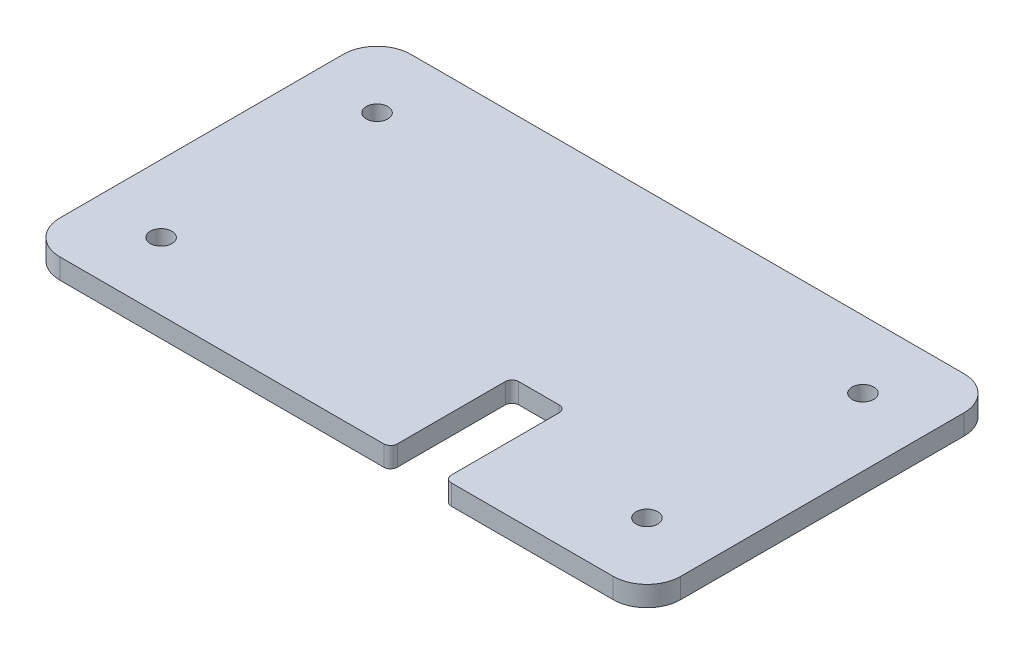
ISO-10303-21;
HEADER;
FILE_DESCRIPTION(('STEP AP214'),'2;1');
FILE_NAME('part.step','',(''),(''),'','','');
FILE_SCHEMA(('AUTOMOTIVE_DESIGN { 1 0 10303 214 1 1 1 1 }'));
ENDSEC;
DATA;
#1=APPLICATION_CONTEXT('core data for automotive mechanical design processes');
#2=APPLICATION_PROTOCOL_DEFINITION('international standard','automotive_design',2000,#1);
#3=PRODUCT_CONTEXT('',#1,'mechanical');
#4=PRODUCT('Part','Part','',(#3));
#5=PRODUCT_RELATED_PRODUCT_CATEGORY('part','',(#4));
#6=PRODUCT_DEFINITION_FORMATION('','',#4);
#7=PRODUCT_DEFINITION_CONTEXT('part definition',#1,'design');
#8=PRODUCT_DEFINITION('design','',#6,#7);
#9=PRODUCT_DEFINITION_SHAPE('','',#8);
#10=(LENGTH_UNIT() NAMED_UNIT(*) SI_UNIT(.MILLI.,.METRE.));
#11=(NAMED_UNIT(*) PLANE_ANGLE_UNIT() SI_UNIT($,.RADIAN.));
#12=(NAMED_UNIT(*) SI_UNIT($,.STERADIAN.) SOLID_ANGLE_UNIT());
#13=UNCERTAINTY_MEASURE_WITH_UNIT(LENGTH_MEASURE(1.E-05),#10,'distance_accuracy_value','');
#14=(GEOMETRIC_REPRESENTATION_CONTEXT(3) GLOBAL_UNCERTAINTY_ASSIGNED_CONTEXT((#13)) GLOBAL_UNIT_ASSIGNED_CONTEXT((#10,
#11,#12)) REPRESENTATION_CONTEXT('',''));
#15=CARTESIAN_POINT('',(0.,0.,0.));
#16=DIRECTION('',(0.,0.,1.));
#17=DIRECTION('',(1.,0.,0.));
#18=AXIS2_PLACEMENT_3D('',#15,#16,#17);
#19=CARTESIAN_POINT('',(0.,3.,0.));
#20=DIRECTION('',(0.,-1.,0.));
#21=DIRECTION('',(0.,0.,-1.));
#22=AXIS2_PLACEMENT_3D('',#19,#20,#21);
#23=PLANE('',#22);
#24=DIRECTION('',(1.,0.,0.));
#25=VECTOR('',#24,1.);
#26=CARTESIAN_POINT('',(-46.,3.,26.));
#27=LINE('',#26,#25);
#28=CARTESIAN_POINT('',(-41.,3.,26.));
#29=VERTEX_POINT('',#28);
#30=CARTESIAN_POINT('',(7.00000000000001,3.,26.));
#31=VERTEX_POINT('',#30);
#32=EDGE_CURVE('E332',#29,#31,#27,.T.);
#33=ORIENTED_EDGE('',*,*,#32,.T.);
#34=CARTESIAN_POINT('',(7.00000000000001,3.,25.));
#35=DIRECTION('',(0.,-1.,0.));
#36=DIRECTION('',(0.,0.,-1.));
#37=AXIS2_PLACEMENT_3D('',#34,#35,#36);
#38=CIRCLE('',#37,1.);
#39=CARTESIAN_POINT('',(8.00000000000001,3.,25.));
#40=VERTEX_POINT('',#39);
#41=EDGE_CURVE('E285',#31,#40,#38,.F.);
#42=ORIENTED_EDGE('',*,*,#41,.T.);
#43=DIRECTION('',(0.,0.,-1.));
#44=VECTOR('',#43,1.);
#45=CARTESIAN_POINT('',(8.00000000000001,3.,26.));
#46=LINE('',#45,#44);
#47=CARTESIAN_POINT('',(8.00000000000001,3.,9.00000000000002));
#48=VERTEX_POINT('',#47);
#49=EDGE_CURVE('E324',#40,#48,#46,.T.);
#50=ORIENTED_EDGE('',*,*,#49,.T.);
#51=CARTESIAN_POINT('',(9.00000000000001,3.,9.00000000000002));
#52=DIRECTION('',(0.,-1.,0.));
#53=DIRECTION('',(0.,0.,-1.));
#54=AXIS2_PLACEMENT_3D('',#51,#52,#53);
#55=CIRCLE('',#54,1.);
#56=CARTESIAN_POINT('',(9.00000000000001,3.,8.00000000000002));
#57=VERTEX_POINT('',#56);
#58=EDGE_CURVE('E11',#48,#57,#55,.T.);
#59=ORIENTED_EDGE('',*,*,#58,.T.);
#60=DIRECTION('',(1.,0.,0.));
#61=VECTOR('',#60,1.);
#62=CARTESIAN_POINT('',(8.00000000000001,3.,8.00000000000002));
#63=LINE('',#62,#61);
#64=CARTESIAN_POINT('',(15.,3.,8.00000000000002));
#65=VERTEX_POINT('',#64);
#66=EDGE_CURVE('E323',#57,#65,#63,.T.);
#67=ORIENTED_EDGE('',*,*,#66,.T.);
#68=CARTESIAN_POINT('',(15.,3.,9.00000000000002));
#69=DIRECTION('',(0.,-1.,0.));
#70=DIRECTION('',(0.,0.,-1.));
#71=AXIS2_PLACEMENT_3D('',#68,#69,#70);
#72=CIRCLE('',#71,1.);
#73=CARTESIAN_POINT('',(16.,3.,9.00000000000002));
#74=VERTEX_POINT('',#73);
#75=EDGE_CURVE('E70',#65,#74,#72,.T.);
#76=ORIENTED_EDGE('',*,*,#75,.T.);
#77=DIRECTION('',(0.,0.,1.));
#78=VECTOR('',#77,1.);
#79=CARTESIAN_POINT('',(16.,3.,8.00000000000002));
#80=LINE('',#79,#78);
#81=CARTESIAN_POINT('',(16.,3.,25.));
#82=VERTEX_POINT('',#81);
#83=EDGE_CURVE('E225',#74,#82,#80,.T.);
#84=ORIENTED_EDGE('',*,*,#83,.T.);
#85=CARTESIAN_POINT('',(17.,3.,25.));
#86=DIRECTION('',(0.,-1.,0.));
#87=DIRECTION('',(0.,0.,-1.));
#88=AXIS2_PLACEMENT_3D('',#85,#86,#87);
#89=CIRCLE('',#88,1.);
#90=CARTESIAN_POINT('',(17.,3.,26.));
#91=VERTEX_POINT('',#90);
#92=EDGE_CURVE('E282',#82,#91,#89,.F.);
#93=ORIENTED_EDGE('',*,*,#92,.T.);
#94=DIRECTION('',(1.,0.,0.));
#95=VECTOR('',#94,1.);
#96=CARTESIAN_POINT('',(16.,3.,26.));
#97=LINE('',#96,#95);
#98=CARTESIAN_POINT('',(41.,3.,26.));
#99=VERTEX_POINT('',#98);
#100=EDGE_CURVE('E223',#91,#99,#97,.T.);
#101=ORIENTED_EDGE('',*,*,#100,.T.);
#102=CARTESIAN_POINT('',(41.,3.,21.));
#103=DIRECTION('',(0.,-1.,0.));
#104=DIRECTION('',(0.,0.,-1.));
#105=AXIS2_PLACEMENT_3D('',#102,#103,#104);
#106=CIRCLE('',#105,5.);
#107=CARTESIAN_POINT('',(46.,3.,21.));
#108=VERTEX_POINT('',#107);
#109=EDGE_CURVE('E245',#99,#108,#106,.F.);
#110=ORIENTED_EDGE('',*,*,#109,.T.);
#111=DIRECTION('',(0.,0.,-1.));
#112=VECTOR('',#111,1.);
#113=CARTESIAN_POINT('',(46.,3.,-26.));
#114=LINE('',#113,#112);
#115=CARTESIAN_POINT('',(46.,3.,-21.));
#116=VERTEX_POINT('',#115);
#117=EDGE_CURVE('E183',#108,#116,#114,.T.);
#118=ORIENTED_EDGE('',*,*,#117,.T.);
#119=CARTESIAN_POINT('',(41.,3.,-21.));
#120=DIRECTION('',(0.,-1.,0.));
#121=DIRECTION('',(0.,0.,-1.));
#122=AXIS2_PLACEMENT_3D('',#119,#120,#121);
#123=CIRCLE('',#122,5.);
#124=CARTESIAN_POINT('',(41.,3.,-26.));
#125=VERTEX_POINT('',#124);
#126=EDGE_CURVE('E242',#116,#125,#123,.F.);
#127=ORIENTED_EDGE('',*,*,#126,.T.);
#128=DIRECTION('',(-1.,0.,0.));
#129=VECTOR('',#128,1.);
#130=CARTESIAN_POINT('',(-46.,3.,-26.));
#131=LINE('',#130,#129);
#132=CARTESIAN_POINT('',(-41.,3.,-26.));
#133=VERTEX_POINT('',#132);
#134=EDGE_CURVE('E341',#125,#133,#131,.T.);
#135=ORIENTED_EDGE('',*,*,#134,.T.);
#136=CARTESIAN_POINT('',(-41.,3.,-21.));
#137=DIRECTION('',(0.,-1.,0.));
#138=DIRECTION('',(0.,0.,-1.));
#139=AXIS2_PLACEMENT_3D('',#136,#137,#138);
#140=CIRCLE('',#139,5.);
#141=CARTESIAN_POINT('',(-46.,3.,-21.));
#142=VERTEX_POINT('',#141);
#143=EDGE_CURVE('E239',#133,#142,#140,.F.);
#144=ORIENTED_EDGE('',*,*,#143,.T.);
#145=DIRECTION('',(0.,0.,1.));
#146=VECTOR('',#145,1.);
#147=CARTESIAN_POINT('',(-46.,3.,-26.));
#148=LINE('',#147,#146);
#149=CARTESIAN_POINT('',(-46.,3.,21.));
#150=VERTEX_POINT('',#149);
#151=EDGE_CURVE('E337',#142,#150,#148,.T.);
#152=ORIENTED_EDGE('',*,*,#151,.T.);
#153=CARTESIAN_POINT('',(-41.,3.,21.));
#154=DIRECTION('',(0.,-1.,0.));
#155=DIRECTION('',(0.,0.,-1.));
#156=AXIS2_PLACEMENT_3D('',#153,#154,#155);
#157=CIRCLE('',#156,5.);
#158=EDGE_CURVE('E236',#150,#29,#157,.F.);
#159=ORIENTED_EDGE('',*,*,#158,.T.);
#160=EDGE_LOOP('',(#33,#42,#50,#59,#67,#76,#84,#93,#101,#110,#118,#127,#135,#144,#152,#159));
#161=FACE_BOUND('',#160,.T.);
#162=CARTESIAN_POINT('',(-36.,3.,16.));
#163=DIRECTION('',(0.,1.,0.));
#164=DIRECTION('',(0.,0.,1.));
#165=AXIS2_PLACEMENT_3D('',#162,#163,#164);
#166=CIRCLE('',#165,1.6);
#167=CARTESIAN_POINT('',(-36.,3.,17.6));
#168=VERTEX_POINT('',#167);
#169=EDGE_CURVE('E201',#168,#168,#166,.T.);
#170=ORIENTED_EDGE('',*,*,#169,.F.);
#171=EDGE_LOOP('',(#170));
#172=FACE_BOUND('',#171,.T.);
#173=CARTESIAN_POINT('',(-36.,3.,-16.));
#174=DIRECTION('',(0.,1.,0.));
#175=DIRECTION('',(0.,0.,1.));
#176=AXIS2_PLACEMENT_3D('',#173,#174,#175);
#177=CIRCLE('',#176,1.6);
#178=CARTESIAN_POINT('',(-36.,3.,-14.4));
#179=VERTEX_POINT('',#178);
#180=EDGE_CURVE('E353',#179,#179,#177,.T.);
#181=ORIENTED_EDGE('',*,*,#180,.F.);
#182=EDGE_LOOP('',(#181));
#183=FACE_BOUND('',#182,.T.);
#184=CARTESIAN_POINT('',(36.,3.,16.));
#185=DIRECTION('',(0.,1.,0.));
#186=DIRECTION('',(0.,0.,1.));
#187=AXIS2_PLACEMENT_3D('',#184,#185,#186);
#188=CIRCLE('',#187,1.6);
#189=CARTESIAN_POINT('',(36.,3.,17.6));
#190=VERTEX_POINT('',#189);
#191=EDGE_CURVE('E361',#190,#190,#188,.T.);
#192=ORIENTED_EDGE('',*,*,#191,.F.);
#193=EDGE_LOOP('',(#192));
#194=FACE_BOUND('',#193,.T.);
#195=CARTESIAN_POINT('',(36.,3.,-16.));
#196=DIRECTION('',(0.,1.,0.));
#197=DIRECTION('',(0.,0.,1.));
#198=AXIS2_PLACEMENT_3D('',#195,#196,#197);
#199=CIRCLE('',#198,1.6);
#200=CARTESIAN_POINT('',(36.,3.,-14.4));
#201=VERTEX_POINT('',#200);
#202=EDGE_CURVE('E369',#201,#201,#199,.T.);
#203=ORIENTED_EDGE('',*,*,#202,.F.);
#204=EDGE_LOOP('',(#203));
#205=FACE_BOUND('',#204,.T.);
#206=ADVANCED_FACE('F47',(#161,#172,#183,#194,#205),#23,.F.);
#207=CARTESIAN_POINT('',(0.,0.,0.));
#208=DIRECTION('',(0.,-1.,0.));
#209=DIRECTION('',(0.,0.,-1.));
#210=AXIS2_PLACEMENT_3D('',#207,#208,#209);
#211=PLANE('',#210);
#212=CARTESIAN_POINT('',(36.,0.,16.));
#213=DIRECTION('',(0.,1.,0.));
#214=DIRECTION('',(0.,0.,1.));
#215=AXIS2_PLACEMENT_3D('',#212,#213,#214);
#216=CIRCLE('',#215,1.6);
#217=CARTESIAN_POINT('',(36.,0.,17.6));
#218=VERTEX_POINT('',#217);
#219=EDGE_CURVE('E365',#218,#218,#216,.T.);
#220=ORIENTED_EDGE('',*,*,#219,.T.);
#221=EDGE_LOOP('',(#220));
#222=FACE_BOUND('',#221,.T.);
#223=CARTESIAN_POINT('',(-36.,0.,16.));
#224=DIRECTION('',(0.,1.,0.));
#225=DIRECTION('',(0.,0.,1.));
#226=AXIS2_PLACEMENT_3D('',#223,#224,#225);
#227=CIRCLE('',#226,1.6);
#228=CARTESIAN_POINT('',(-36.,0.,17.6));
#229=VERTEX_POINT('',#228);
#230=EDGE_CURVE('E349',#229,#229,#227,.T.);
#231=ORIENTED_EDGE('',*,*,#230,.T.);
#232=EDGE_LOOP('',(#231));
#233=FACE_BOUND('',#232,.T.);
#234=DIRECTION('',(0.,0.,-1.));
#235=VECTOR('',#234,1.);
#236=CARTESIAN_POINT('',(8.00000000000001,0.,26.));
#237=LINE('',#236,#235);
#238=CARTESIAN_POINT('',(8.00000000000001,0.,25.));
#239=VERTEX_POINT('',#238);
#240=CARTESIAN_POINT('',(8.00000000000001,0.,9.00000000000002));
#241=VERTEX_POINT('',#240);
#242=EDGE_CURVE('E212',#239,#241,#237,.T.);
#243=ORIENTED_EDGE('',*,*,#242,.F.);
#244=CARTESIAN_POINT('',(7.00000000000001,0.,25.));
#245=DIRECTION('',(0.,-1.,0.));
#246=DIRECTION('',(0.,0.,-1.));
#247=AXIS2_PLACEMENT_3D('',#244,#245,#246);
#248=CIRCLE('',#247,1.);
#249=CARTESIAN_POINT('',(7.00000000000001,0.,26.));
#250=VERTEX_POINT('',#249);
#251=EDGE_CURVE('E276',#239,#250,#248,.T.);
#252=ORIENTED_EDGE('',*,*,#251,.T.);
#253=DIRECTION('',(1.,0.,0.));
#254=VECTOR('',#253,1.);
#255=CARTESIAN_POINT('',(-46.,0.,26.));
#256=LINE('',#255,#254);
#257=CARTESIAN_POINT('',(-41.,0.,26.));
#258=VERTEX_POINT('',#257);
#259=EDGE_CURVE('E208',#258,#250,#256,.T.);
#260=ORIENTED_EDGE('',*,*,#259,.F.);
#261=CARTESIAN_POINT('',(-41.,0.,21.));
#262=DIRECTION('',(0.,-1.,0.));
#263=DIRECTION('',(0.,0.,-1.));
#264=AXIS2_PLACEMENT_3D('',#261,#262,#263);
#265=CIRCLE('',#264,5.);
#266=CARTESIAN_POINT('',(-46.,0.,21.));
#267=VERTEX_POINT('',#266);
#268=EDGE_CURVE('E185',#258,#267,#265,.T.);
#269=ORIENTED_EDGE('',*,*,#268,.T.);
#270=DIRECTION('',(0.,0.,1.));
#271=VECTOR('',#270,1.);
#272=CARTESIAN_POINT('',(-46.,0.,-26.));
#273=LINE('',#272,#271);
#274=CARTESIAN_POINT('',(-46.,0.,-21.));
#275=VERTEX_POINT('',#274);
#276=EDGE_CURVE('E199',#275,#267,#273,.T.);
#277=ORIENTED_EDGE('',*,*,#276,.F.);
#278=CARTESIAN_POINT('',(-41.,0.,-21.));
#279=DIRECTION('',(0.,-1.,0.));
#280=DIRECTION('',(0.,0.,-1.));
#281=AXIS2_PLACEMENT_3D('',#278,#279,#280);
#282=CIRCLE('',#281,5.);
#283=CARTESIAN_POINT('',(-41.,0.,-26.));
#284=VERTEX_POINT('',#283);
#285=EDGE_CURVE('E229',#275,#284,#282,.T.);
#286=ORIENTED_EDGE('',*,*,#285,.T.);
#287=DIRECTION('',(-1.,0.,0.));
#288=VECTOR('',#287,1.);
#289=CARTESIAN_POINT('',(-46.,0.,-26.));
#290=LINE('',#289,#288);
#291=CARTESIAN_POINT('',(41.,0.,-26.));
#292=VERTEX_POINT('',#291);
#293=EDGE_CURVE('E193',#292,#284,#290,.T.);
#294=ORIENTED_EDGE('',*,*,#293,.F.);
#295=CARTESIAN_POINT('',(41.,0.,-21.));
#296=DIRECTION('',(0.,-1.,0.));
#297=DIRECTION('',(0.,0.,-1.));
#298=AXIS2_PLACEMENT_3D('',#295,#296,#297);
#299=CIRCLE('',#298,5.);
#300=CARTESIAN_POINT('',(46.,0.,-21.));
#301=VERTEX_POINT('',#300);
#302=EDGE_CURVE('E174',#292,#301,#299,.T.);
#303=ORIENTED_EDGE('',*,*,#302,.T.);
#304=DIRECTION('',(0.,0.,-1.));
#305=VECTOR('',#304,1.);
#306=CARTESIAN_POINT('',(46.,0.,-26.));
#307=LINE('',#306,#305);
#308=CARTESIAN_POINT('',(46.,0.,21.));
#309=VERTEX_POINT('',#308);
#310=EDGE_CURVE('E180',#309,#301,#307,.T.);
#311=ORIENTED_EDGE('',*,*,#310,.F.);
#312=CARTESIAN_POINT('',(41.,0.,21.));
#313=DIRECTION('',(0.,-1.,0.));
#314=DIRECTION('',(0.,0.,-1.));
#315=AXIS2_PLACEMENT_3D('',#312,#313,#314);
#316=CIRCLE('',#315,5.);
#317=CARTESIAN_POINT('',(41.,0.,26.));
#318=VERTEX_POINT('',#317);
#319=EDGE_CURVE('E163',#309,#318,#316,.T.);
#320=ORIENTED_EDGE('',*,*,#319,.T.);
#321=DIRECTION('',(1.,0.,0.));
#322=VECTOR('',#321,1.);
#323=CARTESIAN_POINT('',(16.,0.,26.));
#324=LINE('',#323,#322);
#325=CARTESIAN_POINT('',(17.,0.,26.));
#326=VERTEX_POINT('',#325);
#327=EDGE_CURVE('E194',#326,#318,#324,.T.);
#328=ORIENTED_EDGE('',*,*,#327,.F.);
#329=CARTESIAN_POINT('',(17.,0.,25.));
#330=DIRECTION('',(0.,-1.,0.));
#331=DIRECTION('',(0.,0.,-1.));
#332=AXIS2_PLACEMENT_3D('',#329,#330,#331);
#333=CIRCLE('',#332,1.);
#334=CARTESIAN_POINT('',(16.,0.,25.));
#335=VERTEX_POINT('',#334);
#336=EDGE_CURVE('E273',#326,#335,#333,.T.);
#337=ORIENTED_EDGE('',*,*,#336,.T.);
#338=DIRECTION('',(0.,0.,1.));
#339=VECTOR('',#338,1.);
#340=CARTESIAN_POINT('',(16.,0.,8.00000000000002));
#341=LINE('',#340,#339);
#342=CARTESIAN_POINT('',(16.,0.,9.00000000000002));
#343=VERTEX_POINT('',#342);
#344=EDGE_CURVE('E220',#343,#335,#341,.T.);
#345=ORIENTED_EDGE('',*,*,#344,.F.);
#346=CARTESIAN_POINT('',(15.,0.,9.00000000000002));
#347=DIRECTION('',(0.,-1.,0.));
#348=DIRECTION('',(0.,0.,-1.));
#349=AXIS2_PLACEMENT_3D('',#346,#347,#348);
#350=CIRCLE('',#349,1.);
#351=CARTESIAN_POINT('',(15.,0.,8.00000000000002));
#352=VERTEX_POINT('',#351);
#353=EDGE_CURVE('E305',#343,#352,#350,.F.);
#354=ORIENTED_EDGE('',*,*,#353,.T.);
#355=DIRECTION('',(1.,0.,0.));
#356=VECTOR('',#355,1.);
#357=CARTESIAN_POINT('',(8.00000000000001,0.,8.00000000000002));
#358=LINE('',#357,#356);
#359=CARTESIAN_POINT('',(9.00000000000001,0.,8.00000000000002));
#360=VERTEX_POINT('',#359);
#361=EDGE_CURVE('E216',#360,#352,#358,.T.);
#362=ORIENTED_EDGE('',*,*,#361,.F.);
#363=CARTESIAN_POINT('',(9.00000000000001,0.,9.00000000000002));
#364=DIRECTION('',(0.,-1.,0.));
#365=DIRECTION('',(0.,0.,-1.));
#366=AXIS2_PLACEMENT_3D('',#363,#364,#365);
#367=CIRCLE('',#366,1.);
#368=EDGE_CURVE('E56',#360,#241,#367,.F.);
#369=ORIENTED_EDGE('',*,*,#368,.T.);
#370=EDGE_LOOP('',(#243,#252,#260,#269,#277,#286,#294,#303,#311,#320,#328,#337,#345,#354,#362,#369));
#371=FACE_BOUND('',#370,.T.);
#372=CARTESIAN_POINT('',(-36.,0.,-16.));
#373=DIRECTION('',(0.,1.,0.));
#374=DIRECTION('',(0.,0.,1.));
#375=AXIS2_PLACEMENT_3D('',#372,#373,#374);
#376=CIRCLE('',#375,1.6);
#377=CARTESIAN_POINT('',(-36.,0.,-14.4));
#378=VERTEX_POINT('',#377);
#379=EDGE_CURVE('E357',#378,#378,#376,.T.);
#380=ORIENTED_EDGE('',*,*,#379,.T.);
#381=EDGE_LOOP('',(#380));
#382=FACE_BOUND('',#381,.T.);
#383=CARTESIAN_POINT('',(36.,0.,-16.));
#384=DIRECTION('',(0.,1.,0.));
#385=DIRECTION('',(0.,0.,1.));
#386=AXIS2_PLACEMENT_3D('',#383,#384,#385);
#387=CIRCLE('',#386,1.6);
#388=CARTESIAN_POINT('',(36.,0.,-14.4));
#389=VERTEX_POINT('',#388);
#390=EDGE_CURVE('E373',#389,#389,#387,.T.);
#391=ORIENTED_EDGE('',*,*,#390,.T.);
#392=EDGE_LOOP('',(#391));
#393=FACE_BOUND('',#392,.T.);
#394=ADVANCED_FACE('F189',(#222,#233,#371,#382,#393),#211,.T.);
#395=CARTESIAN_POINT('',(16.,3.,26.));
#396=DIRECTION('',(0.,0.,-1.));
#397=DIRECTION('',(-1.,0.,0.));
#398=AXIS2_PLACEMENT_3D('',#395,#396,#397);
#399=PLANE('',#398);
#400=ORIENTED_EDGE('',*,*,#100,.F.);
#401=DIRECTION('',(0.,-1.,0.));
#402=VECTOR('',#401,1.);
#403=CARTESIAN_POINT('',(17.,3.,26.));
#404=LINE('',#403,#402);
#405=EDGE_CURVE('E288',#91,#326,#404,.T.);
#406=ORIENTED_EDGE('',*,*,#405,.T.);
#407=ORIENTED_EDGE('',*,*,#327,.T.);
#408=DIRECTION('',(0.,-1.,0.));
#409=VECTOR('',#408,1.);
#410=CARTESIAN_POINT('',(41.,3.,26.));
#411=LINE('',#410,#409);
#412=EDGE_CURVE('E169',#318,#99,#411,.F.);
#413=ORIENTED_EDGE('',*,*,#412,.T.);
#414=EDGE_LOOP('',(#400,#406,#407,#413));
#415=FACE_BOUND('',#414,.T.);
#416=ADVANCED_FACE('F390',(#415),#399,.F.);
#417=CARTESIAN_POINT('',(46.,3.,-26.));
#418=DIRECTION('',(-1.,0.,0.));
#419=DIRECTION('',(0.,0.,1.));
#420=AXIS2_PLACEMENT_3D('',#417,#418,#419);
#421=PLANE('',#420);
#422=ORIENTED_EDGE('',*,*,#117,.F.);
#423=DIRECTION('',(0.,-1.,0.));
#424=VECTOR('',#423,1.);
#425=CARTESIAN_POINT('',(46.,3.,21.));
#426=LINE('',#425,#424);
#427=EDGE_CURVE('E167',#108,#309,#426,.T.);
#428=ORIENTED_EDGE('',*,*,#427,.T.);
#429=ORIENTED_EDGE('',*,*,#310,.T.);
#430=DIRECTION('',(0.,-1.,0.));
#431=VECTOR('',#430,1.);
#432=CARTESIAN_POINT('',(46.,3.,-21.));
#433=LINE('',#432,#431);
#434=EDGE_CURVE('E186',#301,#116,#433,.F.);
#435=ORIENTED_EDGE('',*,*,#434,.T.);
#436=EDGE_LOOP('',(#422,#428,#429,#435));
#437=FACE_BOUND('',#436,.T.);
#438=ADVANCED_FACE('F179',(#437),#421,.F.);
#439=CARTESIAN_POINT('',(-46.,3.,-26.));
#440=DIRECTION('',(0.,0.,1.));
#441=DIRECTION('',(1.,0.,0.));
#442=AXIS2_PLACEMENT_3D('',#439,#440,#441);
#443=PLANE('',#442);
#444=ORIENTED_EDGE('',*,*,#134,.F.);
#445=DIRECTION('',(0.,-1.,0.));
#446=VECTOR('',#445,1.);
#447=CARTESIAN_POINT('',(41.,3.,-26.));
#448=LINE('',#447,#446);
#449=EDGE_CURVE('E251',#125,#292,#448,.T.);
#450=ORIENTED_EDGE('',*,*,#449,.T.);
#451=ORIENTED_EDGE('',*,*,#293,.T.);
#452=DIRECTION('',(0.,-1.,0.));
#453=VECTOR('',#452,1.);
#454=CARTESIAN_POINT('',(-41.,3.,-26.));
#455=LINE('',#454,#453);
#456=EDGE_CURVE('E248',#284,#133,#455,.F.);
#457=ORIENTED_EDGE('',*,*,#456,.T.);
#458=EDGE_LOOP('',(#444,#450,#451,#457));
#459=FACE_BOUND('',#458,.T.);
#460=ADVANCED_FACE('F411',(#459),#443,.F.);
#461=CARTESIAN_POINT('',(-46.,3.,-26.));
#462=DIRECTION('',(1.,0.,0.));
#463=DIRECTION('',(0.,0.,-1.));
#464=AXIS2_PLACEMENT_3D('',#461,#462,#463);
#465=PLANE('',#464);
#466=ORIENTED_EDGE('',*,*,#151,.F.);
#467=DIRECTION('',(0.,-1.,0.));
#468=VECTOR('',#467,1.);
#469=CARTESIAN_POINT('',(-46.,3.,-21.));
#470=LINE('',#469,#468);
#471=EDGE_CURVE('E258',#142,#275,#470,.T.);
#472=ORIENTED_EDGE('',*,*,#471,.T.);
#473=ORIENTED_EDGE('',*,*,#276,.T.);
#474=DIRECTION('',(0.,-1.,0.));
#475=VECTOR('',#474,1.);
#476=CARTESIAN_POINT('',(-46.,3.,21.));
#477=LINE('',#476,#475);
#478=EDGE_CURVE('E255',#267,#150,#477,.F.);
#479=ORIENTED_EDGE('',*,*,#478,.T.);
#480=EDGE_LOOP('',(#466,#472,#473,#479));
#481=FACE_BOUND('',#480,.T.);
#482=ADVANCED_FACE('F407',(#481),#465,.F.);
#483=CARTESIAN_POINT('',(-46.,3.,26.));
#484=DIRECTION('',(0.,0.,-1.));
#485=DIRECTION('',(-1.,0.,0.));
#486=AXIS2_PLACEMENT_3D('',#483,#484,#485);
#487=PLANE('',#486);
#488=ORIENTED_EDGE('',*,*,#259,.T.);
#489=DIRECTION('',(0.,-1.,0.));
#490=VECTOR('',#489,1.);
#491=CARTESIAN_POINT('',(7.00000000000001,3.,26.));
#492=LINE('',#491,#490);
#493=EDGE_CURVE('E279',#250,#31,#492,.F.);
#494=ORIENTED_EDGE('',*,*,#493,.T.);
#495=ORIENTED_EDGE('',*,*,#32,.F.);
#496=DIRECTION('',(0.,-1.,0.));
#497=VECTOR('',#496,1.);
#498=CARTESIAN_POINT('',(-41.,3.,26.));
#499=LINE('',#498,#497);
#500=EDGE_CURVE('E262',#29,#258,#499,.T.);
#501=ORIENTED_EDGE('',*,*,#500,.T.);
#502=EDGE_LOOP('',(#488,#494,#495,#501));
#503=FACE_BOUND('',#502,.T.);
#504=ADVANCED_FACE('F404',(#503),#487,.F.);
#505=CARTESIAN_POINT('',(8.00000000000001,3.,26.));
#506=DIRECTION('',(-1.,0.,0.));
#507=DIRECTION('',(0.,0.,1.));
#508=AXIS2_PLACEMENT_3D('',#505,#506,#507);
#509=PLANE('',#508);
#510=ORIENTED_EDGE('',*,*,#49,.F.);
#511=DIRECTION('',(0.,-1.,0.));
#512=VECTOR('',#511,1.);
#513=CARTESIAN_POINT('',(8.00000000000001,3.,25.));
#514=LINE('',#513,#512);
#515=EDGE_CURVE('E269',#40,#239,#514,.T.);
#516=ORIENTED_EDGE('',*,*,#515,.T.);
#517=ORIENTED_EDGE('',*,*,#242,.T.);
#518=DIRECTION('',(0.,-1.,0.));
#519=VECTOR('',#518,1.);
#520=CARTESIAN_POINT('',(8.00000000000001,3.,9.00000000000002));
#521=LINE('',#520,#519);
#522=EDGE_CURVE('E266',#241,#48,#521,.F.);
#523=ORIENTED_EDGE('',*,*,#522,.T.);
#524=EDGE_LOOP('',(#510,#516,#517,#523));
#525=FACE_BOUND('',#524,.T.);
#526=ADVANCED_FACE('F316',(#525),#509,.F.);
#527=CARTESIAN_POINT('',(8.00000000000001,3.,8.00000000000002));
#528=DIRECTION('',(0.,0.,-1.));
#529=DIRECTION('',(-1.,0.,0.));
#530=AXIS2_PLACEMENT_3D('',#527,#528,#529);
#531=PLANE('',#530);
#532=ORIENTED_EDGE('',*,*,#361,.T.);
#533=DIRECTION('',(0.,-1.,0.));
#534=VECTOR('',#533,1.);
#535=CARTESIAN_POINT('',(15.,3.,8.00000000000002));
#536=LINE('',#535,#534);
#537=EDGE_CURVE('E302',#352,#65,#536,.F.);
#538=ORIENTED_EDGE('',*,*,#537,.T.);
#539=ORIENTED_EDGE('',*,*,#66,.F.);
#540=DIRECTION('',(0.,-1.,0.));
#541=VECTOR('',#540,1.);
#542=CARTESIAN_POINT('',(9.00000000000001,0.,8.00000000000002));
#543=LINE('',#542,#541);
#544=EDGE_CURVE('E298',#57,#360,#543,.T.);
#545=ORIENTED_EDGE('',*,*,#544,.T.);
#546=EDGE_LOOP('',(#532,#538,#539,#545));
#547=FACE_BOUND('',#546,.T.);
#548=ADVANCED_FACE('F326',(#547),#531,.F.);
#549=CARTESIAN_POINT('',(16.,3.,8.00000000000002));
#550=DIRECTION('',(1.,0.,0.));
#551=DIRECTION('',(0.,0.,-1.));
#552=AXIS2_PLACEMENT_3D('',#549,#550,#551);
#553=PLANE('',#552);
#554=ORIENTED_EDGE('',*,*,#344,.T.);
#555=DIRECTION('',(0.,-1.,0.));
#556=VECTOR('',#555,1.);
#557=CARTESIAN_POINT('',(16.,3.,25.));
#558=LINE('',#557,#556);
#559=EDGE_CURVE('E63',#335,#82,#558,.F.);
#560=ORIENTED_EDGE('',*,*,#559,.T.);
#561=ORIENTED_EDGE('',*,*,#83,.F.);
#562=DIRECTION('',(0.,-1.,0.));
#563=VECTOR('',#562,1.);
#564=CARTESIAN_POINT('',(16.,0.,9.00000000000002));
#565=LINE('',#564,#563);
#566=EDGE_CURVE('E292',#74,#343,#565,.T.);
#567=ORIENTED_EDGE('',*,*,#566,.T.);
#568=EDGE_LOOP('',(#554,#560,#561,#567));
#569=FACE_BOUND('',#568,.T.);
#570=ADVANCED_FACE('F397',(#569),#553,.F.);
#571=CARTESIAN_POINT('',(-36.,3.,16.));
#572=DIRECTION('',(0.,-1.,0.));
#573=DIRECTION('',(0.,0.,-1.));
#574=AXIS2_PLACEMENT_3D('',#571,#572,#573);
#575=CYLINDRICAL_SURFACE('',#574,1.6);
#576=ORIENTED_EDGE('',*,*,#169,.T.);
#577=EDGE_LOOP('',(#576));
#578=FACE_BOUND('',#577,.T.);
#579=ORIENTED_EDGE('',*,*,#230,.F.);
#580=EDGE_LOOP('',(#579));
#581=FACE_BOUND('',#580,.T.);
#582=ADVANCED_FACE('F394',(#578,#581),#575,.F.);
#583=CARTESIAN_POINT('',(-36.,3.,-16.));
#584=DIRECTION('',(0.,-1.,0.));
#585=DIRECTION('',(0.,0.,-1.));
#586=AXIS2_PLACEMENT_3D('',#583,#584,#585);
#587=CYLINDRICAL_SURFACE('',#586,1.6);
#588=ORIENTED_EDGE('',*,*,#180,.T.);
#589=EDGE_LOOP('',(#588));
#590=FACE_BOUND('',#589,.T.);
#591=ORIENTED_EDGE('',*,*,#379,.F.);
#592=EDGE_LOOP('',(#591));
#593=FACE_BOUND('',#592,.T.);
#594=ADVANCED_FACE('F528',(#590,#593),#587,.F.);
#595=CARTESIAN_POINT('',(36.,3.,16.));
#596=DIRECTION('',(0.,-1.,0.));
#597=DIRECTION('',(0.,0.,-1.));
#598=AXIS2_PLACEMENT_3D('',#595,#596,#597);
#599=CYLINDRICAL_SURFACE('',#598,1.6);
#600=ORIENTED_EDGE('',*,*,#191,.T.);
#601=EDGE_LOOP('',(#600));
#602=FACE_BOUND('',#601,.T.);
#603=ORIENTED_EDGE('',*,*,#219,.F.);
#604=EDGE_LOOP('',(#603));
#605=FACE_BOUND('',#604,.T.);
#606=ADVANCED_FACE('F519',(#602,#605),#599,.F.);
#607=CARTESIAN_POINT('',(36.,3.,-16.));
#608=DIRECTION('',(0.,-1.,0.));
#609=DIRECTION('',(0.,0.,-1.));
#610=AXIS2_PLACEMENT_3D('',#607,#608,#609);
#611=CYLINDRICAL_SURFACE('',#610,1.6);
#612=ORIENTED_EDGE('',*,*,#202,.T.);
#613=EDGE_LOOP('',(#612));
#614=FACE_BOUND('',#613,.T.);
#615=ORIENTED_EDGE('',*,*,#390,.F.);
#616=EDGE_LOOP('',(#615));
#617=FACE_BOUND('',#616,.T.);
#618=ADVANCED_FACE('F381',(#614,#617),#611,.F.);
#619=CARTESIAN_POINT('',(41.,3.,21.));
#620=DIRECTION('',(0.,-1.,0.));
#621=DIRECTION('',(0.,0.,-1.));
#622=AXIS2_PLACEMENT_3D('',#619,#620,#621);
#623=CYLINDRICAL_SURFACE('',#622,5.);
#624=ORIENTED_EDGE('',*,*,#109,.F.);
#625=ORIENTED_EDGE('',*,*,#412,.F.);
#626=ORIENTED_EDGE('',*,*,#319,.F.);
#627=ORIENTED_EDGE('',*,*,#427,.F.);
#628=EDGE_LOOP('',(#624,#625,#626,#627));
#629=FACE_BOUND('',#628,.T.);
#630=ADVANCED_FACE('F166',(#629),#623,.T.);
#631=CARTESIAN_POINT('',(41.,3.,-21.));
#632=DIRECTION('',(0.,-1.,0.));
#633=DIRECTION('',(0.,0.,-1.));
#634=AXIS2_PLACEMENT_3D('',#631,#632,#633);
#635=CYLINDRICAL_SURFACE('',#634,5.);
#636=ORIENTED_EDGE('',*,*,#126,.F.);
#637=ORIENTED_EDGE('',*,*,#434,.F.);
#638=ORIENTED_EDGE('',*,*,#302,.F.);
#639=ORIENTED_EDGE('',*,*,#449,.F.);
#640=EDGE_LOOP('',(#636,#637,#638,#639));
#641=FACE_BOUND('',#640,.T.);
#642=ADVANCED_FACE('F423',(#641),#635,.T.);
#643=CARTESIAN_POINT('',(-41.,3.,-21.));
#644=DIRECTION('',(0.,-1.,0.));
#645=DIRECTION('',(0.,0.,-1.));
#646=AXIS2_PLACEMENT_3D('',#643,#644,#645);
#647=CYLINDRICAL_SURFACE('',#646,5.);
#648=ORIENTED_EDGE('',*,*,#143,.F.);
#649=ORIENTED_EDGE('',*,*,#456,.F.);
#650=ORIENTED_EDGE('',*,*,#285,.F.);
#651=ORIENTED_EDGE('',*,*,#471,.F.);
#652=EDGE_LOOP('',(#648,#649,#650,#651));
#653=FACE_BOUND('',#652,.T.);
#654=ADVANCED_FACE('F426',(#653),#647,.T.);
#655=CARTESIAN_POINT('',(-41.,3.,21.));
#656=DIRECTION('',(0.,-1.,0.));
#657=DIRECTION('',(0.,0.,-1.));
#658=AXIS2_PLACEMENT_3D('',#655,#656,#657);
#659=CYLINDRICAL_SURFACE('',#658,5.);
#660=ORIENTED_EDGE('',*,*,#158,.F.);
#661=ORIENTED_EDGE('',*,*,#478,.F.);
#662=ORIENTED_EDGE('',*,*,#268,.F.);
#663=ORIENTED_EDGE('',*,*,#500,.F.);
#664=EDGE_LOOP('',(#660,#661,#662,#663));
#665=FACE_BOUND('',#664,.T.);
#666=ADVANCED_FACE('F430',(#665),#659,.T.);
#667=CARTESIAN_POINT('',(7.00000000000001,3.,25.));
#668=DIRECTION('',(0.,-1.,0.));
#669=DIRECTION('',(0.,0.,-1.));
#670=AXIS2_PLACEMENT_3D('',#667,#668,#669);
#671=CYLINDRICAL_SURFACE('',#670,1.);
#672=ORIENTED_EDGE('',*,*,#41,.F.);
#673=ORIENTED_EDGE('',*,*,#493,.F.);
#674=ORIENTED_EDGE('',*,*,#251,.F.);
#675=ORIENTED_EDGE('',*,*,#515,.F.);
#676=EDGE_LOOP('',(#672,#673,#674,#675));
#677=FACE_BOUND('',#676,.T.);
#678=ADVANCED_FACE('F433',(#677),#671,.T.);
#679=CARTESIAN_POINT('',(17.,3.,25.));
#680=DIRECTION('',(0.,-1.,0.));
#681=DIRECTION('',(0.,0.,-1.));
#682=AXIS2_PLACEMENT_3D('',#679,#680,#681);
#683=CYLINDRICAL_SURFACE('',#682,1.);
#684=ORIENTED_EDGE('',*,*,#92,.F.);
#685=ORIENTED_EDGE('',*,*,#559,.F.);
#686=ORIENTED_EDGE('',*,*,#336,.F.);
#687=ORIENTED_EDGE('',*,*,#405,.F.);
#688=EDGE_LOOP('',(#684,#685,#686,#687));
#689=FACE_BOUND('',#688,.T.);
#690=ADVANCED_FACE('F437',(#689),#683,.T.);
#691=CARTESIAN_POINT('',(15.,3.,9.00000000000002));
#692=DIRECTION('',(0.,1.,0.));
#693=DIRECTION('',(0.,0.,1.));
#694=AXIS2_PLACEMENT_3D('',#691,#692,#693);
#695=CYLINDRICAL_SURFACE('',#694,1.);
#696=ORIENTED_EDGE('',*,*,#75,.F.);
#697=ORIENTED_EDGE('',*,*,#537,.F.);
#698=ORIENTED_EDGE('',*,*,#353,.F.);
#699=ORIENTED_EDGE('',*,*,#566,.F.);
#700=EDGE_LOOP('',(#696,#697,#698,#699));
#701=FACE_BOUND('',#700,.T.);
#702=ADVANCED_FACE('F440',(#701),#695,.F.);
#703=CARTESIAN_POINT('',(9.00000000000001,3.,9.00000000000002));
#704=DIRECTION('',(0.,1.,0.));
#705=DIRECTION('',(0.,0.,1.));
#706=AXIS2_PLACEMENT_3D('',#703,#704,#705);
#707=CYLINDRICAL_SURFACE('',#706,1.);
#708=ORIENTED_EDGE('',*,*,#58,.F.);
#709=ORIENTED_EDGE('',*,*,#522,.F.);
#710=ORIENTED_EDGE('',*,*,#368,.F.);
#711=ORIENTED_EDGE('',*,*,#544,.F.);
#712=EDGE_LOOP('',(#708,#709,#710,#711));
#713=FACE_BOUND('',#712,.T.);
#714=ADVANCED_FACE('F49',(#713),#707,.F.);
#715=CLOSED_SHELL('',(#206,#394,#416,#438,#460,#482,#504,#526,#548,#570,#582,#594,#606,#618,
#630,#642,#654,#666,#678,#690,#702,#714));
#716=MANIFOLD_SOLID_BREP('B2',#715);
#717=ADVANCED_BREP_SHAPE_REPRESENTATION('',(#18,#716),#14);
#718=SHAPE_DEFINITION_REPRESENTATION(#9,#717);
ENDSEC;
END-ISO-10303-21;
